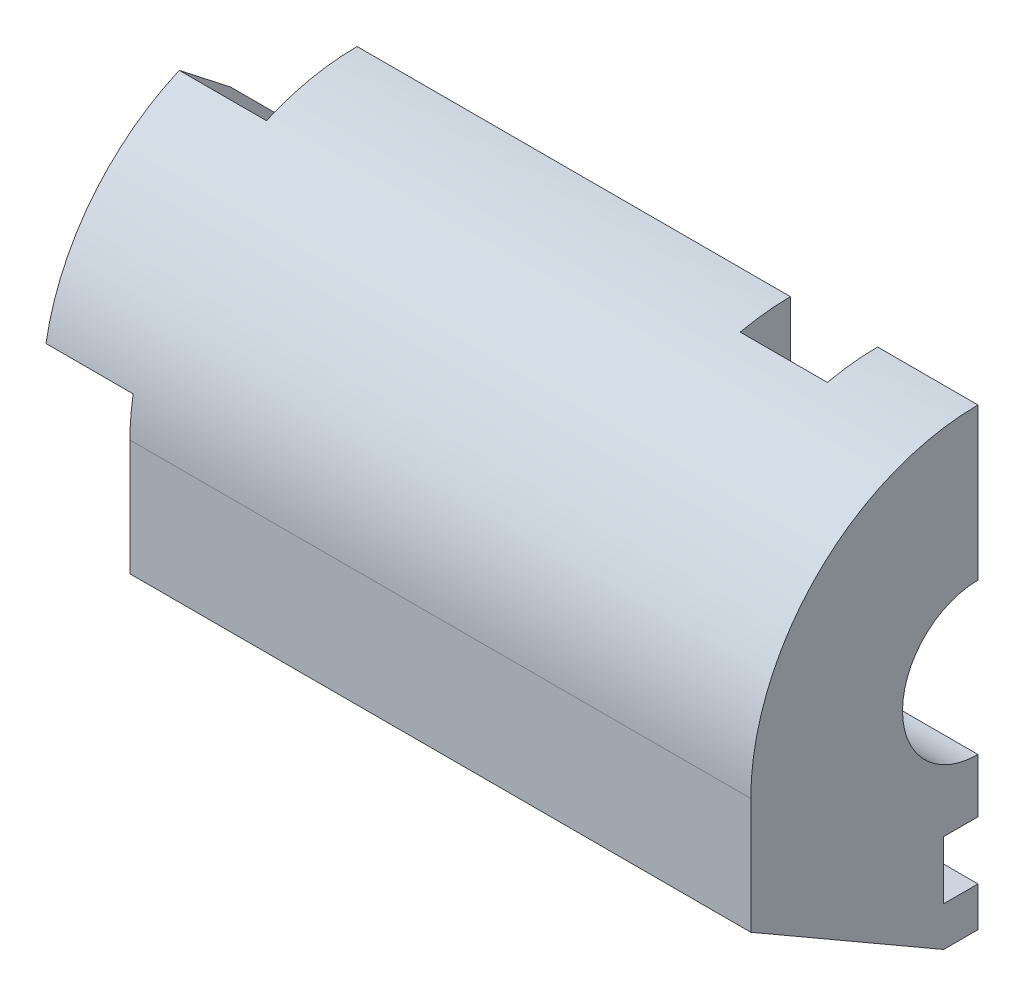
ISO-10303-21;
HEADER;
FILE_DESCRIPTION(('STEP AP214'),'2;1');
FILE_NAME('part.step','',(''),(''),'','','');
FILE_SCHEMA(('AUTOMOTIVE_DESIGN { 1 0 10303 214 1 1 1 1 }'));
ENDSEC;
DATA;
#1=APPLICATION_CONTEXT('core data for automotive mechanical design processes');
#2=APPLICATION_PROTOCOL_DEFINITION('international standard','automotive_design',2000,#1);
#3=PRODUCT_CONTEXT('',#1,'mechanical');
#4=PRODUCT('Part','Part','',(#3));
#5=PRODUCT_RELATED_PRODUCT_CATEGORY('part','',(#4));
#6=PRODUCT_DEFINITION_FORMATION('','',#4);
#7=PRODUCT_DEFINITION_CONTEXT('part definition',#1,'design');
#8=PRODUCT_DEFINITION('design','',#6,#7);
#9=PRODUCT_DEFINITION_SHAPE('','',#8);
#10=(LENGTH_UNIT() NAMED_UNIT(*) SI_UNIT(.MILLI.,.METRE.));
#11=(NAMED_UNIT(*) PLANE_ANGLE_UNIT() SI_UNIT($,.RADIAN.));
#12=(NAMED_UNIT(*) SI_UNIT($,.STERADIAN.) SOLID_ANGLE_UNIT());
#13=UNCERTAINTY_MEASURE_WITH_UNIT(LENGTH_MEASURE(1.E-05),#10,'distance_accuracy_value','');
#14=(GEOMETRIC_REPRESENTATION_CONTEXT(3) GLOBAL_UNCERTAINTY_ASSIGNED_CONTEXT((#13)) GLOBAL_UNIT_ASSIGNED_CONTEXT((#10,
#11,#12)) REPRESENTATION_CONTEXT('',''));
#15=CARTESIAN_POINT('',(0.,0.,0.));
#16=DIRECTION('',(0.,0.,1.));
#17=DIRECTION('',(1.,0.,0.));
#18=AXIS2_PLACEMENT_3D('',#15,#16,#17);
#19=CARTESIAN_POINT('',(0.,0.,0.));
#20=DIRECTION('',(1.,0.,0.));
#21=DIRECTION('',(0.,0.,-1.));
#22=AXIS2_PLACEMENT_3D('',#19,#20,#21);
#23=PLANE('',#22);
#24=DIRECTION('',(0.,0.623445593572299,0.781866735355382));
#25=VECTOR('',#24,1.);
#26=CARTESIAN_POINT('',(0.,-32.450386517934,25.8753180938543));
#27=LINE('',#26,#25);
#28=CARTESIAN_POINT('',(0.,-0.90970565626694,65.4306689222948));
#29=VERTEX_POINT('',#28);
#30=CARTESIAN_POINT('',(0.,14.5089341349479,84.7672745242393));
#31=VERTEX_POINT('',#30);
#32=EDGE_CURVE('E207',#29,#31,#27,.T.);
#33=ORIENTED_EDGE('',*,*,#32,.F.);
#34=DIRECTION('',(0.,-0.788010753606721,0.615661475325659));
#35=VECTOR('',#34,1.);
#36=CARTESIAN_POINT('',(0.,31.3987352416086,40.1885484339428));
#37=LINE('',#36,#35);
#38=CARTESIAN_POINT('',(0.,63.7071761394842,14.9464279455908));
#39=VERTEX_POINT('',#38);
#40=EDGE_CURVE('E218',#39,#29,#37,.T.);
#41=ORIENTED_EDGE('',*,*,#40,.F.);
#42=DIRECTION('',(0.,0.615661475325659,0.788010753606721));
#43=VECTOR('',#42,1.);
#44=CARTESIAN_POINT('',(0.,32.3084408978756,-25.242120488352));
#45=LINE('',#44,#43);
#46=CARTESIAN_POINT('',(0.,78.8509825487562,34.3296162386903));
#47=VERTEX_POINT('',#46);
#48=EDGE_CURVE('E216',#39,#47,#45,.T.);
#49=ORIENTED_EDGE('',*,*,#48,.T.);
#50=CARTESIAN_POINT('',(0.,0.,0.));
#51=DIRECTION('',(1.,0.,0.));
#52=DIRECTION('',(0.,0.,-1.));
#53=AXIS2_PLACEMENT_3D('',#50,#51,#52);
#54=CIRCLE('',#53,86.);
#55=CARTESIAN_POINT('',(0.,86.,0.));
#56=VERTEX_POINT('',#55);
#57=EDGE_CURVE('E327',#56,#47,#54,.T.);
#58=ORIENTED_EDGE('',*,*,#57,.F.);
#59=DIRECTION('',(0.,1.,0.));
#60=VECTOR('',#59,1.);
#61=CARTESIAN_POINT('',(0.,-86.,0.));
#62=LINE('',#61,#60);
#63=CARTESIAN_POINT('',(0.,44.45,0.));
#64=VERTEX_POINT('',#63);
#65=EDGE_CURVE('E329',#64,#56,#62,.T.);
#66=ORIENTED_EDGE('',*,*,#65,.F.);
#67=CARTESIAN_POINT('',(0.,0.,0.));
#68=DIRECTION('',(1.,0.,0.));
#69=DIRECTION('',(0.,0.,-1.));
#70=AXIS2_PLACEMENT_3D('',#67,#68,#69);
#71=CIRCLE('',#70,44.45);
#72=CARTESIAN_POINT('',(0.,-44.45,0.));
#73=VERTEX_POINT('',#72);
#74=EDGE_CURVE('E276',#64,#73,#71,.T.);
#75=ORIENTED_EDGE('',*,*,#74,.T.);
#76=CARTESIAN_POINT('',(0.,-86.,0.));
#77=VERTEX_POINT('',#76);
#78=EDGE_CURVE('E330',#77,#73,#62,.T.);
#79=ORIENTED_EDGE('',*,*,#78,.F.);
#80=DIRECTION('',(0.,0.,-1.));
#81=VECTOR('',#80,1.);
#82=CARTESIAN_POINT('',(0.,-86.,13.));
#83=LINE('',#82,#81);
#84=CARTESIAN_POINT('',(0.,-86.,13.));
#85=VERTEX_POINT('',#84);
#86=EDGE_CURVE('E307',#85,#77,#83,.T.);
#87=ORIENTED_EDGE('',*,*,#86,.F.);
#88=DIRECTION('',(0.,0.499999999999995,0.866025403784442));
#89=VECTOR('',#88,1.);
#90=CARTESIAN_POINT('',(0.,-86.,13.));
#91=LINE('',#90,#89);
#92=CARTESIAN_POINT('',(0.,-43.8534303491579,86.));
#93=VERTEX_POINT('',#92);
#94=EDGE_CURVE('E302',#85,#93,#91,.T.);
#95=ORIENTED_EDGE('',*,*,#94,.T.);
#96=DIRECTION('',(0.,1.,0.));
#97=VECTOR('',#96,1.);
#98=CARTESIAN_POINT('',(0.,-43.8534303491579,86.));
#99=LINE('',#98,#97);
#100=CARTESIAN_POINT('',(0.,0.,86.));
#101=VERTEX_POINT('',#100);
#102=EDGE_CURVE('E323',#93,#101,#99,.T.);
#103=ORIENTED_EDGE('',*,*,#102,.T.);
#104=EDGE_CURVE('E326',#31,#101,#54,.T.);
#105=ORIENTED_EDGE('',*,*,#104,.F.);
#106=EDGE_LOOP('',(#33,#41,#49,#58,#66,#75,#79,#87,#95,#103,#105));
#107=FACE_BOUND('',#106,.T.);
#108=ADVANCED_FACE('F39',(#107),#23,.F.);
#109=CARTESIAN_POINT('',(235.,-86.,0.));
#110=DIRECTION('',(0.,0.,1.));
#111=DIRECTION('',(1.,0.,0.));
#112=AXIS2_PLACEMENT_3D('',#109,#110,#111);
#113=PLANE('',#112);
#114=DIRECTION('',(0.,-1.,0.));
#115=VECTOR('',#114,1.);
#116=CARTESIAN_POINT('',(164.,0.,0.));
#117=LINE('',#116,#115);
#118=CARTESIAN_POINT('',(164.,86.,0.));
#119=VERTEX_POINT('',#118);
#120=CARTESIAN_POINT('',(164.,28.575,0.));
#121=VERTEX_POINT('',#120);
#122=EDGE_CURVE('E259',#119,#121,#117,.T.);
#123=ORIENTED_EDGE('',*,*,#122,.T.);
#124=DIRECTION('',(-1.,0.,0.));
#125=VECTOR('',#124,1.);
#126=CARTESIAN_POINT('',(235.,28.575,0.));
#127=LINE('',#126,#125);
#128=CARTESIAN_POINT('',(78.0000000000001,28.575,0.));
#129=VERTEX_POINT('',#128);
#130=EDGE_CURVE('E299',#129,#121,#127,.F.);
#131=ORIENTED_EDGE('',*,*,#130,.F.);
#132=DIRECTION('',(0.,1.,0.));
#133=VECTOR('',#132,1.);
#134=CARTESIAN_POINT('',(78.,-86.,0.));
#135=LINE('',#134,#133);
#136=CARTESIAN_POINT('',(78.,44.45,0.));
#137=VERTEX_POINT('',#136);
#138=EDGE_CURVE('E285',#129,#137,#135,.T.);
#139=ORIENTED_EDGE('',*,*,#138,.T.);
#140=DIRECTION('',(-1.,0.,0.));
#141=VECTOR('',#140,1.);
#142=CARTESIAN_POINT('',(78.,44.45,0.));
#143=LINE('',#142,#141);
#144=EDGE_CURVE('E290',#64,#137,#143,.F.);
#145=ORIENTED_EDGE('',*,*,#144,.F.);
#146=ORIENTED_EDGE('',*,*,#65,.T.);
#147=DIRECTION('',(-1.,0.,0.));
#148=VECTOR('',#147,1.);
#149=CARTESIAN_POINT('',(235.,86.,0.));
#150=LINE('',#149,#148);
#151=EDGE_CURVE('E342',#119,#56,#150,.T.);
#152=ORIENTED_EDGE('',*,*,#151,.F.);
#153=EDGE_LOOP('',(#123,#131,#139,#145,#146,#152));
#154=FACE_BOUND('',#153,.T.);
#155=ADVANCED_FACE('F374',(#154),#113,.F.);
#156=CARTESIAN_POINT('',(197.,28.575,0.));
#157=VERTEX_POINT('',#156);
#158=CARTESIAN_POINT('',(235.,28.575,0.));
#159=VERTEX_POINT('',#158);
#160=EDGE_CURVE('E298',#157,#159,#127,.F.);
#161=ORIENTED_EDGE('',*,*,#160,.F.);
#162=DIRECTION('',(0.,-1.,0.));
#163=VECTOR('',#162,1.);
#164=CARTESIAN_POINT('',(197.,0.,0.));
#165=LINE('',#164,#163);
#166=CARTESIAN_POINT('',(197.,86.,0.));
#167=VERTEX_POINT('',#166);
#168=EDGE_CURVE('E254',#167,#157,#165,.T.);
#169=ORIENTED_EDGE('',*,*,#168,.F.);
#170=CARTESIAN_POINT('',(235.,86.,0.));
#171=VERTEX_POINT('',#170);
#172=EDGE_CURVE('E340',#171,#167,#150,.T.);
#173=ORIENTED_EDGE('',*,*,#172,.F.);
#174=DIRECTION('',(0.,1.,0.));
#175=VECTOR('',#174,1.);
#176=CARTESIAN_POINT('',(235.,0.,0.));
#177=LINE('',#176,#175);
#178=EDGE_CURVE('E312',#159,#171,#177,.T.);
#179=ORIENTED_EDGE('',*,*,#178,.F.);
#180=EDGE_LOOP('',(#161,#169,#173,#179));
#181=FACE_BOUND('',#180,.T.);
#182=ADVANCED_FACE('F387',(#181),#113,.F.);
#183=CARTESIAN_POINT('',(125.,-60.,0.));
#184=DIRECTION('',(0.,0.,1.));
#185=DIRECTION('',(1.,0.,0.));
#186=AXIS2_PLACEMENT_3D('',#183,#184,#185);
#187=CIRCLE('',#186,11.);
#188=CARTESIAN_POINT('',(125.,-71.,0.));
#189=VERTEX_POINT('',#188);
#190=CARTESIAN_POINT('',(125.,-49.,0.));
#191=VERTEX_POINT('',#190);
#192=EDGE_CURVE('E226',#189,#191,#187,.F.);
#193=ORIENTED_EDGE('',*,*,#192,.F.);
#194=DIRECTION('',(-1.,0.,0.));
#195=VECTOR('',#194,1.);
#196=CARTESIAN_POINT('',(0.,-71.,0.));
#197=LINE('',#196,#195);
#198=CARTESIAN_POINT('',(235.,-71.,0.));
#199=VERTEX_POINT('',#198);
#200=EDGE_CURVE('E242',#199,#189,#197,.T.);
#201=ORIENTED_EDGE('',*,*,#200,.F.);
#202=CARTESIAN_POINT('',(235.,-86.,0.));
#203=VERTEX_POINT('',#202);
#204=EDGE_CURVE('E313',#203,#199,#177,.T.);
#205=ORIENTED_EDGE('',*,*,#204,.F.);
#206=DIRECTION('',(-1.,0.,0.));
#207=VECTOR('',#206,1.);
#208=CARTESIAN_POINT('',(235.,-86.,0.));
#209=LINE('',#208,#207);
#210=EDGE_CURVE('E337',#203,#77,#209,.T.);
#211=ORIENTED_EDGE('',*,*,#210,.T.);
#212=ORIENTED_EDGE('',*,*,#78,.T.);
#213=DIRECTION('',(-1.,0.,0.));
#214=VECTOR('',#213,1.);
#215=CARTESIAN_POINT('',(78.,-44.45,0.));
#216=LINE('',#215,#214);
#217=CARTESIAN_POINT('',(78.,-44.45,0.));
#218=VERTEX_POINT('',#217);
#219=EDGE_CURVE('E288',#218,#73,#216,.T.);
#220=ORIENTED_EDGE('',*,*,#219,.F.);
#221=DIRECTION('',(0.,1.,0.));
#222=VECTOR('',#221,1.);
#223=CARTESIAN_POINT('',(78.,-86.,0.));
#224=LINE('',#223,#222);
#225=CARTESIAN_POINT('',(78.,-28.575,0.));
#226=VERTEX_POINT('',#225);
#227=EDGE_CURVE('E280',#218,#226,#224,.T.);
#228=ORIENTED_EDGE('',*,*,#227,.T.);
#229=DIRECTION('',(-1.,0.,0.));
#230=VECTOR('',#229,1.);
#231=CARTESIAN_POINT('',(235.,-28.575,0.));
#232=LINE('',#231,#230);
#233=CARTESIAN_POINT('',(235.,-28.575,0.));
#234=VERTEX_POINT('',#233);
#235=EDGE_CURVE('E295',#234,#226,#232,.T.);
#236=ORIENTED_EDGE('',*,*,#235,.F.);
#237=CARTESIAN_POINT('',(235.,-49.,0.));
#238=VERTEX_POINT('',#237);
#239=EDGE_CURVE('E317',#238,#234,#177,.T.);
#240=ORIENTED_EDGE('',*,*,#239,.F.);
#241=DIRECTION('',(1.,0.,0.));
#242=VECTOR('',#241,1.);
#243=CARTESIAN_POINT('',(0.,-49.,0.));
#244=LINE('',#243,#242);
#245=EDGE_CURVE('E233',#191,#238,#244,.T.);
#246=ORIENTED_EDGE('',*,*,#245,.F.);
#247=EDGE_LOOP('',(#193,#201,#205,#211,#212,#220,#228,#236,#240,#246));
#248=FACE_BOUND('',#247,.T.);
#249=ADVANCED_FACE('F398',(#248),#113,.F.);
#250=CARTESIAN_POINT('',(235.,-86.,13.));
#251=DIRECTION('',(0.,-0.866025403784442,0.499999999999995));
#252=DIRECTION('',(0.,-0.499999999999995,-0.866025403784442));
#253=AXIS2_PLACEMENT_3D('',#250,#251,#252);
#254=PLANE('',#253);
#255=ORIENTED_EDGE('',*,*,#94,.F.);
#256=DIRECTION('',(-1.,0.,0.));
#257=VECTOR('',#256,1.);
#258=CARTESIAN_POINT('',(235.,-86.,13.));
#259=LINE('',#258,#257);
#260=CARTESIAN_POINT('',(235.,-86.,13.));
#261=VERTEX_POINT('',#260);
#262=EDGE_CURVE('E334',#261,#85,#259,.T.);
#263=ORIENTED_EDGE('',*,*,#262,.F.);
#264=DIRECTION('',(0.,0.499999999999995,0.866025403784442));
#265=VECTOR('',#264,1.);
#266=CARTESIAN_POINT('',(235.,-86.,13.));
#267=LINE('',#266,#265);
#268=CARTESIAN_POINT('',(235.,-43.8534303491579,86.));
#269=VERTEX_POINT('',#268);
#270=EDGE_CURVE('E303',#261,#269,#267,.T.);
#271=ORIENTED_EDGE('',*,*,#270,.T.);
#272=DIRECTION('',(-1.,0.,0.));
#273=VECTOR('',#272,1.);
#274=CARTESIAN_POINT('',(235.,-43.8534303491579,86.));
#275=LINE('',#274,#273);
#276=EDGE_CURVE('E320',#269,#93,#275,.T.);
#277=ORIENTED_EDGE('',*,*,#276,.T.);
#278=EDGE_LOOP('',(#255,#263,#271,#277));
#279=FACE_BOUND('',#278,.T.);
#280=ADVANCED_FACE('F41',(#279),#254,.T.);
#281=CARTESIAN_POINT('',(235.,-86.,13.));
#282=DIRECTION('',(0.,1.,0.));
#283=DIRECTION('',(0.,0.,1.));
#284=AXIS2_PLACEMENT_3D('',#281,#282,#283);
#285=PLANE('',#284);
#286=ORIENTED_EDGE('',*,*,#86,.T.);
#287=ORIENTED_EDGE('',*,*,#210,.F.);
#288=DIRECTION('',(0.,0.,-1.));
#289=VECTOR('',#288,1.);
#290=CARTESIAN_POINT('',(235.,-86.,13.));
#291=LINE('',#290,#289);
#292=EDGE_CURVE('E316',#261,#203,#291,.T.);
#293=ORIENTED_EDGE('',*,*,#292,.F.);
#294=ORIENTED_EDGE('',*,*,#262,.T.);
#295=EDGE_LOOP('',(#286,#287,#293,#294));
#296=FACE_BOUND('',#295,.T.);
#297=ADVANCED_FACE('F421',(#296),#285,.F.);
#298=CARTESIAN_POINT('',(235.,0.,0.));
#299=DIRECTION('',(-1.,0.,0.));
#300=DIRECTION('',(0.,0.,1.));
#301=AXIS2_PLACEMENT_3D('',#298,#299,#300);
#302=CYLINDRICAL_SURFACE('',#301,86.);
#303=ORIENTED_EDGE('',*,*,#172,.T.);
#304=CARTESIAN_POINT('',(197.,0.,0.));
#305=DIRECTION('',(1.,0.,0.));
#306=DIRECTION('',(0.,1.,0.));
#307=AXIS2_PLACEMENT_3D('',#304,#305,#306);
#308=CIRCLE('',#307,86.);
#309=CARTESIAN_POINT('',(197.,83.8749068553879,19.));
#310=VERTEX_POINT('',#309);
#311=EDGE_CURVE('E273',#167,#310,#308,.T.);
#312=ORIENTED_EDGE('',*,*,#311,.T.);
#313=DIRECTION('',(-1.,0.,0.));
#314=VECTOR('',#313,1.);
#315=CARTESIAN_POINT('',(235.,83.8749068553879,19.));
#316=LINE('',#315,#314);
#317=CARTESIAN_POINT('',(164.,83.8749068553879,19.));
#318=VERTEX_POINT('',#317);
#319=EDGE_CURVE('E11',#310,#318,#316,.T.);
#320=ORIENTED_EDGE('',*,*,#319,.T.);
#321=CARTESIAN_POINT('',(164.,0.,0.));
#322=DIRECTION('',(1.,0.,0.));
#323=DIRECTION('',(0.,1.,0.));
#324=AXIS2_PLACEMENT_3D('',#321,#322,#323);
#325=CIRCLE('',#324,86.);
#326=EDGE_CURVE('E271',#119,#318,#325,.T.);
#327=ORIENTED_EDGE('',*,*,#326,.F.);
#328=ORIENTED_EDGE('',*,*,#151,.T.);
#329=ORIENTED_EDGE('',*,*,#57,.T.);
#330=DIRECTION('',(1.,0.,0.));
#331=VECTOR('',#330,1.);
#332=CARTESIAN_POINT('',(-33.,78.8509825487562,34.3296162386903));
#333=LINE('',#332,#331);
#334=CARTESIAN_POINT('',(-33.,78.8509825487562,34.3296162386903));
#335=VERTEX_POINT('',#334);
#336=EDGE_CURVE('E54',#335,#47,#333,.T.);
#337=ORIENTED_EDGE('',*,*,#336,.F.);
#338=CARTESIAN_POINT('',(-33.,0.,0.));
#339=DIRECTION('',(1.,0.,0.));
#340=DIRECTION('',(0.,0.,-1.));
#341=AXIS2_PLACEMENT_3D('',#338,#339,#340);
#342=CIRCLE('',#341,86.);
#343=CARTESIAN_POINT('',(-33.,14.5089341349479,84.7672745242393));
#344=VERTEX_POINT('',#343);
#345=EDGE_CURVE('E196',#344,#335,#342,.F.);
#346=ORIENTED_EDGE('',*,*,#345,.F.);
#347=DIRECTION('',(1.,0.,0.));
#348=VECTOR('',#347,1.);
#349=CARTESIAN_POINT('',(-33.,14.5089341349479,84.7672745242393));
#350=LINE('',#349,#348);
#351=EDGE_CURVE('E204',#344,#31,#350,.T.);
#352=ORIENTED_EDGE('',*,*,#351,.T.);
#353=ORIENTED_EDGE('',*,*,#104,.T.);
#354=DIRECTION('',(-1.,0.,0.));
#355=VECTOR('',#354,1.);
#356=CARTESIAN_POINT('',(235.,0.,86.));
#357=LINE('',#356,#355);
#358=CARTESIAN_POINT('',(235.,0.,86.));
#359=VERTEX_POINT('',#358);
#360=EDGE_CURVE('E343',#359,#101,#357,.T.);
#361=ORIENTED_EDGE('',*,*,#360,.F.);
#362=CARTESIAN_POINT('',(235.,0.,0.));
#363=DIRECTION('',(1.,0.,0.));
#364=DIRECTION('',(0.,0.,-1.));
#365=AXIS2_PLACEMENT_3D('',#362,#363,#364);
#366=CIRCLE('',#365,86.);
#367=EDGE_CURVE('E310',#171,#359,#366,.T.);
#368=ORIENTED_EDGE('',*,*,#367,.F.);
#369=EDGE_LOOP('',(#303,#312,#320,#327,#328,#329,#337,#346,#352,#353,#361,#368));
#370=FACE_BOUND('',#369,.T.);
#371=ADVANCED_FACE('F214',(#370),#302,.T.);
#372=CARTESIAN_POINT('',(235.,-43.8534303491579,86.));
#373=DIRECTION('',(0.,0.,1.));
#374=DIRECTION('',(1.,0.,0.));
#375=AXIS2_PLACEMENT_3D('',#372,#373,#374);
#376=PLANE('',#375);
#377=ORIENTED_EDGE('',*,*,#102,.F.);
#378=ORIENTED_EDGE('',*,*,#276,.F.);
#379=DIRECTION('',(0.,1.,0.));
#380=VECTOR('',#379,1.);
#381=CARTESIAN_POINT('',(235.,-43.8534303491579,86.));
#382=LINE('',#381,#380);
#383=EDGE_CURVE('E306',#269,#359,#382,.T.);
#384=ORIENTED_EDGE('',*,*,#383,.T.);
#385=ORIENTED_EDGE('',*,*,#360,.T.);
#386=EDGE_LOOP('',(#377,#378,#384,#385));
#387=FACE_BOUND('',#386,.T.);
#388=ADVANCED_FACE('F412',(#387),#376,.T.);
#389=CARTESIAN_POINT('',(235.,0.,0.));
#390=DIRECTION('',(1.,0.,0.));
#391=DIRECTION('',(0.,0.,-1.));
#392=AXIS2_PLACEMENT_3D('',#389,#390,#391);
#393=PLANE('',#392);
#394=DIRECTION('',(0.,0.,-1.));
#395=VECTOR('',#394,1.);
#396=CARTESIAN_POINT('',(235.,-71.,13.));
#397=LINE('',#396,#395);
#398=CARTESIAN_POINT('',(235.,-71.,13.));
#399=VERTEX_POINT('',#398);
#400=EDGE_CURVE('E250',#399,#199,#397,.T.);
#401=ORIENTED_EDGE('',*,*,#400,.F.);
#402=DIRECTION('',(0.,-1.,0.));
#403=VECTOR('',#402,1.);
#404=CARTESIAN_POINT('',(235.,0.,13.));
#405=LINE('',#404,#403);
#406=CARTESIAN_POINT('',(235.,-49.,13.));
#407=VERTEX_POINT('',#406);
#408=EDGE_CURVE('E236',#407,#399,#405,.T.);
#409=ORIENTED_EDGE('',*,*,#408,.F.);
#410=DIRECTION('',(0.,0.,-1.));
#411=VECTOR('',#410,1.);
#412=CARTESIAN_POINT('',(235.,-49.,13.));
#413=LINE('',#412,#411);
#414=EDGE_CURVE('E247',#407,#238,#413,.T.);
#415=ORIENTED_EDGE('',*,*,#414,.T.);
#416=ORIENTED_EDGE('',*,*,#239,.T.);
#417=CARTESIAN_POINT('',(235.,0.,0.));
#418=DIRECTION('',(1.,0.,0.));
#419=DIRECTION('',(0.,0.,-1.));
#420=AXIS2_PLACEMENT_3D('',#417,#418,#419);
#421=CIRCLE('',#420,28.575);
#422=EDGE_CURVE('E292',#159,#234,#421,.T.);
#423=ORIENTED_EDGE('',*,*,#422,.F.);
#424=ORIENTED_EDGE('',*,*,#178,.T.);
#425=ORIENTED_EDGE('',*,*,#367,.T.);
#426=ORIENTED_EDGE('',*,*,#383,.F.);
#427=ORIENTED_EDGE('',*,*,#270,.F.);
#428=ORIENTED_EDGE('',*,*,#292,.T.);
#429=ORIENTED_EDGE('',*,*,#204,.T.);
#430=EDGE_LOOP('',(#401,#409,#415,#416,#423,#424,#425,#426,#427,#428,#429));
#431=FACE_BOUND('',#430,.T.);
#432=ADVANCED_FACE('F392',(#431),#393,.T.);
#433=CARTESIAN_POINT('',(235.,0.,0.));
#434=DIRECTION('',(-1.,0.,0.));
#435=DIRECTION('',(0.,0.,1.));
#436=AXIS2_PLACEMENT_3D('',#433,#434,#435);
#437=CYLINDRICAL_SURFACE('',#436,28.575);
#438=CARTESIAN_POINT('',(197.,0.,0.));
#439=DIRECTION('',(1.,0.,0.));
#440=DIRECTION('',(0.,1.,0.));
#441=AXIS2_PLACEMENT_3D('',#438,#439,#440);
#442=CIRCLE('',#441,28.575);
#443=CARTESIAN_POINT('',(197.,24.3686494205528,14.9231213363087));
#444=VERTEX_POINT('',#443);
#445=EDGE_CURVE('E47',#157,#444,#442,.T.);
#446=ORIENTED_EDGE('',*,*,#445,.F.);
#447=ORIENTED_EDGE('',*,*,#160,.T.);
#448=ORIENTED_EDGE('',*,*,#422,.T.);
#449=ORIENTED_EDGE('',*,*,#235,.T.);
#450=CARTESIAN_POINT('',(78.,0.,0.));
#451=DIRECTION('',(1.,0.,0.));
#452=DIRECTION('',(0.,0.,-1.));
#453=AXIS2_PLACEMENT_3D('',#450,#451,#452);
#454=CIRCLE('',#453,28.575);
#455=EDGE_CURVE('E336',#129,#226,#454,.T.);
#456=ORIENTED_EDGE('',*,*,#455,.F.);
#457=ORIENTED_EDGE('',*,*,#130,.T.);
#458=CARTESIAN_POINT('',(164.,0.,0.));
#459=DIRECTION('',(1.,0.,0.));
#460=DIRECTION('',(0.,1.,0.));
#461=AXIS2_PLACEMENT_3D('',#458,#459,#460);
#462=CIRCLE('',#461,28.575);
#463=CARTESIAN_POINT('',(164.,24.3686494205528,14.9231213363087));
#464=VERTEX_POINT('',#463);
#465=EDGE_CURVE('E348',#121,#464,#462,.T.);
#466=ORIENTED_EDGE('',*,*,#465,.T.);
#467=DIRECTION('',(-1.,0.,0.));
#468=VECTOR('',#467,1.);
#469=CARTESIAN_POINT('',(235.,24.3686494205528,14.9231213363087));
#470=LINE('',#469,#468);
#471=EDGE_CURVE('E351',#444,#464,#470,.T.);
#472=ORIENTED_EDGE('',*,*,#471,.F.);
#473=EDGE_LOOP('',(#446,#447,#448,#449,#456,#457,#466,#472));
#474=FACE_BOUND('',#473,.T.);
#475=ADVANCED_FACE('F366',(#474),#437,.F.);
#476=CARTESIAN_POINT('',(78.,0.,0.));
#477=DIRECTION('',(-1.,0.,0.));
#478=DIRECTION('',(0.,0.,1.));
#479=AXIS2_PLACEMENT_3D('',#476,#477,#478);
#480=CYLINDRICAL_SURFACE('',#479,44.45);
#481=ORIENTED_EDGE('',*,*,#144,.T.);
#482=CARTESIAN_POINT('',(78.,0.,0.));
#483=DIRECTION('',(1.,0.,0.));
#484=DIRECTION('',(0.,0.,-1.));
#485=AXIS2_PLACEMENT_3D('',#482,#483,#484);
#486=CIRCLE('',#485,44.45);
#487=EDGE_CURVE('E277',#137,#218,#486,.T.);
#488=ORIENTED_EDGE('',*,*,#487,.T.);
#489=ORIENTED_EDGE('',*,*,#219,.T.);
#490=ORIENTED_EDGE('',*,*,#74,.F.);
#491=EDGE_LOOP('',(#481,#488,#489,#490));
#492=FACE_BOUND('',#491,.T.);
#493=ADVANCED_FACE('F458',(#492),#480,.F.);
#494=CARTESIAN_POINT('',(78.,0.,0.));
#495=DIRECTION('',(1.,0.,0.));
#496=DIRECTION('',(0.,0.,-1.));
#497=AXIS2_PLACEMENT_3D('',#494,#495,#496);
#498=PLANE('',#497);
#499=ORIENTED_EDGE('',*,*,#455,.T.);
#500=ORIENTED_EDGE('',*,*,#227,.F.);
#501=ORIENTED_EDGE('',*,*,#487,.F.);
#502=ORIENTED_EDGE('',*,*,#138,.F.);
#503=EDGE_LOOP('',(#499,#500,#501,#502));
#504=FACE_BOUND('',#503,.T.);
#505=ADVANCED_FACE('F401',(#504),#498,.F.);
#506=CARTESIAN_POINT('',(0.,0.,19.));
#507=DIRECTION('',(0.,0.,1.));
#508=DIRECTION('',(1.,0.,0.));
#509=AXIS2_PLACEMENT_3D('',#506,#507,#508);
#510=PLANE('',#509);
#511=DIRECTION('',(0.,-1.,0.));
#512=VECTOR('',#511,1.);
#513=CARTESIAN_POINT('',(197.,0.,19.));
#514=LINE('',#513,#512);
#515=CARTESIAN_POINT('',(197.,24.3686494205528,19.));
#516=VERTEX_POINT('',#515);
#517=EDGE_CURVE('E258',#310,#516,#514,.T.);
#518=ORIENTED_EDGE('',*,*,#517,.T.);
#519=DIRECTION('',(-1.,0.,0.));
#520=VECTOR('',#519,1.);
#521=CARTESIAN_POINT('',(0.,24.3686494205528,19.));
#522=LINE('',#521,#520);
#523=CARTESIAN_POINT('',(164.,24.3686494205528,19.));
#524=VERTEX_POINT('',#523);
#525=EDGE_CURVE('E255',#516,#524,#522,.T.);
#526=ORIENTED_EDGE('',*,*,#525,.T.);
#527=DIRECTION('',(0.,-1.,0.));
#528=VECTOR('',#527,1.);
#529=CARTESIAN_POINT('',(164.,0.,19.));
#530=LINE('',#529,#528);
#531=EDGE_CURVE('E261',#318,#524,#530,.T.);
#532=ORIENTED_EDGE('',*,*,#531,.F.);
#533=ORIENTED_EDGE('',*,*,#319,.F.);
#534=EDGE_LOOP('',(#518,#526,#532,#533));
#535=FACE_BOUND('',#534,.T.);
#536=ADVANCED_FACE('F381',(#535),#510,.F.);
#537=CARTESIAN_POINT('',(197.,0.,19.));
#538=DIRECTION('',(1.,0.,0.));
#539=DIRECTION('',(0.,1.,0.));
#540=AXIS2_PLACEMENT_3D('',#537,#538,#539);
#541=PLANE('',#540);
#542=ORIENTED_EDGE('',*,*,#168,.T.);
#543=ORIENTED_EDGE('',*,*,#445,.T.);
#544=DIRECTION('',(0.,0.,-1.));
#545=VECTOR('',#544,1.);
#546=CARTESIAN_POINT('',(197.,24.3686494205528,19.));
#547=LINE('',#546,#545);
#548=EDGE_CURVE('E268',#516,#444,#547,.T.);
#549=ORIENTED_EDGE('',*,*,#548,.F.);
#550=ORIENTED_EDGE('',*,*,#517,.F.);
#551=ORIENTED_EDGE('',*,*,#311,.F.);
#552=EDGE_LOOP('',(#542,#543,#549,#550,#551));
#553=FACE_BOUND('',#552,.T.);
#554=ADVANCED_FACE('F356',(#553),#541,.F.);
#555=CARTESIAN_POINT('',(164.,0.,19.));
#556=DIRECTION('',(1.,0.,0.));
#557=DIRECTION('',(0.,1.,0.));
#558=AXIS2_PLACEMENT_3D('',#555,#556,#557);
#559=PLANE('',#558);
#560=ORIENTED_EDGE('',*,*,#326,.T.);
#561=ORIENTED_EDGE('',*,*,#531,.T.);
#562=DIRECTION('',(0.,0.,-1.));
#563=VECTOR('',#562,1.);
#564=CARTESIAN_POINT('',(164.,24.3686494205528,19.));
#565=LINE('',#564,#563);
#566=EDGE_CURVE('E263',#524,#464,#565,.T.);
#567=ORIENTED_EDGE('',*,*,#566,.T.);
#568=ORIENTED_EDGE('',*,*,#465,.F.);
#569=ORIENTED_EDGE('',*,*,#122,.F.);
#570=EDGE_LOOP('',(#560,#561,#567,#568,#569));
#571=FACE_BOUND('',#570,.T.);
#572=ADVANCED_FACE('F370',(#571),#559,.T.);
#573=CARTESIAN_POINT('',(0.,24.3686494205528,19.));
#574=DIRECTION('',(0.,-1.,0.));
#575=DIRECTION('',(0.,0.,-1.));
#576=AXIS2_PLACEMENT_3D('',#573,#574,#575);
#577=PLANE('',#576);
#578=ORIENTED_EDGE('',*,*,#471,.T.);
#579=ORIENTED_EDGE('',*,*,#566,.F.);
#580=ORIENTED_EDGE('',*,*,#525,.F.);
#581=ORIENTED_EDGE('',*,*,#548,.T.);
#582=EDGE_LOOP('',(#578,#579,#580,#581));
#583=FACE_BOUND('',#582,.T.);
#584=ADVANCED_FACE('F364',(#583),#577,.F.);
#585=CARTESIAN_POINT('',(125.,-60.,13.));
#586=DIRECTION('',(0.,0.,-1.));
#587=DIRECTION('',(-1.,0.,0.));
#588=AXIS2_PLACEMENT_3D('',#585,#586,#587);
#589=CYLINDRICAL_SURFACE('',#588,11.);
#590=ORIENTED_EDGE('',*,*,#192,.T.);
#591=DIRECTION('',(0.,0.,-1.));
#592=VECTOR('',#591,1.);
#593=CARTESIAN_POINT('',(125.,-49.,13.));
#594=LINE('',#593,#592);
#595=CARTESIAN_POINT('',(125.,-49.,13.));
#596=VERTEX_POINT('',#595);
#597=EDGE_CURVE('E239',#596,#191,#594,.T.);
#598=ORIENTED_EDGE('',*,*,#597,.F.);
#599=CARTESIAN_POINT('',(125.,-60.,13.));
#600=DIRECTION('',(0.,0.,1.));
#601=DIRECTION('',(1.,0.,0.));
#602=AXIS2_PLACEMENT_3D('',#599,#600,#601);
#603=CIRCLE('',#602,11.);
#604=CARTESIAN_POINT('',(125.,-71.,13.));
#605=VERTEX_POINT('',#604);
#606=EDGE_CURVE('E230',#605,#596,#603,.F.);
#607=ORIENTED_EDGE('',*,*,#606,.F.);
#608=DIRECTION('',(0.,0.,-1.));
#609=VECTOR('',#608,1.);
#610=CARTESIAN_POINT('',(125.,-71.,13.));
#611=LINE('',#610,#609);
#612=EDGE_CURVE('E252',#605,#189,#611,.T.);
#613=ORIENTED_EDGE('',*,*,#612,.T.);
#614=EDGE_LOOP('',(#590,#598,#607,#613));
#615=FACE_BOUND('',#614,.T.);
#616=ADVANCED_FACE('F468',(#615),#589,.F.);
#617=CARTESIAN_POINT('',(0.,-71.,13.));
#618=DIRECTION('',(0.,-1.,0.));
#619=DIRECTION('',(1.,0.,0.));
#620=AXIS2_PLACEMENT_3D('',#617,#618,#619);
#621=PLANE('',#620);
#622=ORIENTED_EDGE('',*,*,#200,.T.);
#623=ORIENTED_EDGE('',*,*,#612,.F.);
#624=DIRECTION('',(-1.,0.,0.));
#625=VECTOR('',#624,1.);
#626=CARTESIAN_POINT('',(0.,-71.,13.));
#627=LINE('',#626,#625);
#628=EDGE_CURVE('E232',#399,#605,#627,.T.);
#629=ORIENTED_EDGE('',*,*,#628,.F.);
#630=ORIENTED_EDGE('',*,*,#400,.T.);
#631=EDGE_LOOP('',(#622,#623,#629,#630));
#632=FACE_BOUND('',#631,.T.);
#633=ADVANCED_FACE('F424',(#632),#621,.F.);
#634=CARTESIAN_POINT('',(0.,-49.,13.));
#635=DIRECTION('',(0.,1.,0.));
#636=DIRECTION('',(0.,0.,1.));
#637=AXIS2_PLACEMENT_3D('',#634,#635,#636);
#638=PLANE('',#637);
#639=ORIENTED_EDGE('',*,*,#245,.T.);
#640=ORIENTED_EDGE('',*,*,#414,.F.);
#641=DIRECTION('',(1.,0.,0.));
#642=VECTOR('',#641,1.);
#643=CARTESIAN_POINT('',(0.,-49.,13.));
#644=LINE('',#643,#642);
#645=EDGE_CURVE('E62',#596,#407,#644,.T.);
#646=ORIENTED_EDGE('',*,*,#645,.F.);
#647=ORIENTED_EDGE('',*,*,#597,.T.);
#648=EDGE_LOOP('',(#639,#640,#646,#647));
#649=FACE_BOUND('',#648,.T.);
#650=ADVANCED_FACE('F428',(#649),#638,.F.);
#651=CARTESIAN_POINT('',(0.,0.,13.));
#652=DIRECTION('',(0.,0.,1.));
#653=DIRECTION('',(1.,0.,0.));
#654=AXIS2_PLACEMENT_3D('',#651,#652,#653);
#655=PLANE('',#654);
#656=ORIENTED_EDGE('',*,*,#606,.T.);
#657=ORIENTED_EDGE('',*,*,#645,.T.);
#658=ORIENTED_EDGE('',*,*,#408,.T.);
#659=ORIENTED_EDGE('',*,*,#628,.T.);
#660=EDGE_LOOP('',(#656,#657,#658,#659));
#661=FACE_BOUND('',#660,.T.);
#662=ADVANCED_FACE('F426',(#661),#655,.F.);
#663=CARTESIAN_POINT('',(-33.,32.3084408978756,-25.242120488352));
#664=DIRECTION('',(0.,0.788010753606721,-0.615661475325659));
#665=DIRECTION('',(0.,0.615661475325659,0.788010753606721));
#666=AXIS2_PLACEMENT_3D('',#663,#664,#665);
#667=PLANE('',#666);
#668=ORIENTED_EDGE('',*,*,#48,.F.);
#669=DIRECTION('',(1.,0.,0.));
#670=VECTOR('',#669,1.);
#671=CARTESIAN_POINT('',(-33.,63.7071761394842,14.9464279455908));
#672=LINE('',#671,#670);
#673=CARTESIAN_POINT('',(-33.,63.7071761394842,14.9464279455908));
#674=VERTEX_POINT('',#673);
#675=EDGE_CURVE('E227',#674,#39,#672,.T.);
#676=ORIENTED_EDGE('',*,*,#675,.F.);
#677=DIRECTION('',(0.,0.615661475325659,0.788010753606721));
#678=VECTOR('',#677,1.);
#679=CARTESIAN_POINT('',(-33.,32.3084408978756,-25.242120488352));
#680=LINE('',#679,#678);
#681=EDGE_CURVE('E211',#674,#335,#680,.T.);
#682=ORIENTED_EDGE('',*,*,#681,.T.);
#683=ORIENTED_EDGE('',*,*,#336,.T.);
#684=EDGE_LOOP('',(#668,#676,#682,#683));
#685=FACE_BOUND('',#684,.T.);
#686=ADVANCED_FACE('F407',(#685),#667,.T.);
#687=CARTESIAN_POINT('',(-33.,31.3987352416086,40.1885484339428));
#688=DIRECTION('',(0.,0.615661475325659,0.788010753606721));
#689=DIRECTION('',(0.,-0.788010753606721,0.615661475325659));
#690=AXIS2_PLACEMENT_3D('',#687,#688,#689);
#691=PLANE('',#690);
#692=ORIENTED_EDGE('',*,*,#40,.T.);
#693=DIRECTION('',(1.,0.,0.));
#694=VECTOR('',#693,1.);
#695=CARTESIAN_POINT('',(-33.,-0.90970565626694,65.4306689222948));
#696=LINE('',#695,#694);
#697=CARTESIAN_POINT('',(-33.,-0.90970565626694,65.4306689222948));
#698=VERTEX_POINT('',#697);
#699=EDGE_CURVE('E210',#698,#29,#696,.T.);
#700=ORIENTED_EDGE('',*,*,#699,.F.);
#701=DIRECTION('',(0.,-0.788010753606721,0.615661475325659));
#702=VECTOR('',#701,1.);
#703=CARTESIAN_POINT('',(-33.,31.3987352416086,40.1885484339428));
#704=LINE('',#703,#702);
#705=EDGE_CURVE('E198',#674,#698,#704,.T.);
#706=ORIENTED_EDGE('',*,*,#705,.F.);
#707=ORIENTED_EDGE('',*,*,#675,.T.);
#708=EDGE_LOOP('',(#692,#700,#706,#707));
#709=FACE_BOUND('',#708,.T.);
#710=ADVANCED_FACE('F409',(#709),#691,.F.);
#711=CARTESIAN_POINT('',(-33.,-32.450386517934,25.8753180938543));
#712=DIRECTION('',(0.,0.781866735355382,-0.623445593572299));
#713=DIRECTION('',(0.,0.623445593572299,0.781866735355382));
#714=AXIS2_PLACEMENT_3D('',#711,#712,#713);
#715=PLANE('',#714);
#716=ORIENTED_EDGE('',*,*,#32,.T.);
#717=ORIENTED_EDGE('',*,*,#351,.F.);
#718=DIRECTION('',(0.,0.623445593572299,0.781866735355382));
#719=VECTOR('',#718,1.);
#720=CARTESIAN_POINT('',(-33.,-32.450386517934,25.8753180938543));
#721=LINE('',#720,#719);
#722=EDGE_CURVE('E191',#698,#344,#721,.T.);
#723=ORIENTED_EDGE('',*,*,#722,.F.);
#724=ORIENTED_EDGE('',*,*,#699,.T.);
#725=EDGE_LOOP('',(#716,#717,#723,#724));
#726=FACE_BOUND('',#725,.T.);
#727=ADVANCED_FACE('F205',(#726),#715,.F.);
#728=CARTESIAN_POINT('',(-33.,0.,0.));
#729=DIRECTION('',(1.,0.,0.));
#730=DIRECTION('',(0.,0.,-1.));
#731=AXIS2_PLACEMENT_3D('',#728,#729,#730);
#732=PLANE('',#731);
#733=ORIENTED_EDGE('',*,*,#345,.T.);
#734=ORIENTED_EDGE('',*,*,#681,.F.);
#735=ORIENTED_EDGE('',*,*,#705,.T.);
#736=ORIENTED_EDGE('',*,*,#722,.T.);
#737=EDGE_LOOP('',(#733,#734,#735,#736));
#738=FACE_BOUND('',#737,.T.);
#739=ADVANCED_FACE('F193',(#738),#732,.F.);
#740=CLOSED_SHELL('',(#108,#155,#182,#249,#280,#297,#371,#388,#432,#475,#493,#505,#536,#554,
#572,#584,#616,#633,#650,#662,#686,#710,#727,#739));
#741=MANIFOLD_SOLID_BREP('B2',#740);
#742=ADVANCED_BREP_SHAPE_REPRESENTATION('',(#18,#741),#14);
#743=SHAPE_DEFINITION_REPRESENTATION(#9,#742);
ENDSEC;
END-ISO-10303-21;
